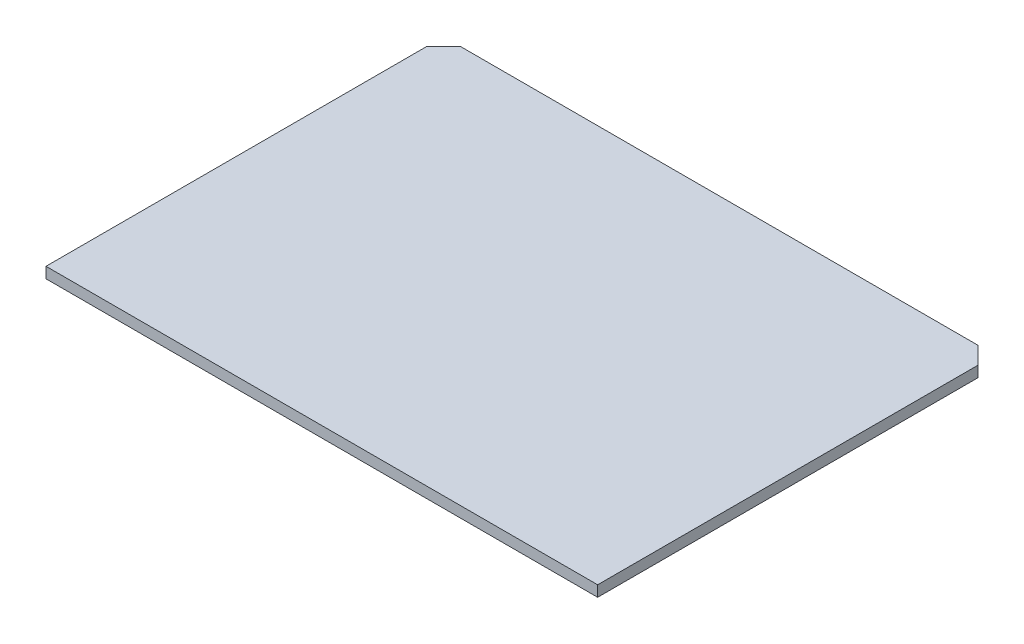
ISO-10303-21;
HEADER;
FILE_DESCRIPTION(('STEP AP214'),'2;1');
FILE_NAME('part.step','',(''),(''),'','','');
FILE_SCHEMA(('AUTOMOTIVE_DESIGN { 1 0 10303 214 1 1 1 1 }'));
ENDSEC;
DATA;
#1=APPLICATION_CONTEXT('core data for automotive mechanical design processes');
#2=APPLICATION_PROTOCOL_DEFINITION('international standard','automotive_design',2000,#1);
#3=PRODUCT_CONTEXT('',#1,'mechanical');
#4=PRODUCT('Part','Part','',(#3));
#5=PRODUCT_RELATED_PRODUCT_CATEGORY('part','',(#4));
#6=PRODUCT_DEFINITION_FORMATION('','',#4);
#7=PRODUCT_DEFINITION_CONTEXT('part definition',#1,'design');
#8=PRODUCT_DEFINITION('design','',#6,#7);
#9=PRODUCT_DEFINITION_SHAPE('','',#8);
#10=(LENGTH_UNIT() NAMED_UNIT(*) SI_UNIT(.MILLI.,.METRE.));
#11=(NAMED_UNIT(*) PLANE_ANGLE_UNIT() SI_UNIT($,.RADIAN.));
#12=(NAMED_UNIT(*) SI_UNIT($,.STERADIAN.) SOLID_ANGLE_UNIT());
#13=UNCERTAINTY_MEASURE_WITH_UNIT(LENGTH_MEASURE(1.E-05),#10,'distance_accuracy_value','');
#14=(GEOMETRIC_REPRESENTATION_CONTEXT(3) GLOBAL_UNCERTAINTY_ASSIGNED_CONTEXT((#13)) GLOBAL_UNIT_ASSIGNED_CONTEXT((#10,
#11,#12)) REPRESENTATION_CONTEXT('',''));
#15=CARTESIAN_POINT('',(0.,0.,0.));
#16=DIRECTION('',(0.,0.,1.));
#17=DIRECTION('',(1.,0.,0.));
#18=AXIS2_PLACEMENT_3D('',#15,#16,#17);
#19=CARTESIAN_POINT('',(40.64,1.6,-29.29));
#20=DIRECTION('',(-1.,0.,0.));
#21=DIRECTION('',(0.,0.,1.));
#22=AXIS2_PLACEMENT_3D('',#19,#20,#21);
#23=PLANE('',#22);
#24=DIRECTION('',(0.,0.,-1.));
#25=VECTOR('',#24,1.);
#26=CARTESIAN_POINT('',(40.64,0.,-29.29));
#27=LINE('',#26,#25);
#28=CARTESIAN_POINT('',(40.64,0.,29.29));
#29=VERTEX_POINT('',#28);
#30=CARTESIAN_POINT('',(40.64,0.,-26.75));
#31=VERTEX_POINT('',#30);
#32=EDGE_CURVE('E110',#29,#31,#27,.T.);
#33=ORIENTED_EDGE('',*,*,#32,.T.);
#34=DIRECTION('',(0.,1.,0.));
#35=VECTOR('',#34,1.);
#36=CARTESIAN_POINT('',(40.64,1.6,-26.75));
#37=LINE('',#36,#35);
#38=CARTESIAN_POINT('',(40.64,1.6,-26.75));
#39=VERTEX_POINT('',#38);
#40=EDGE_CURVE('E54',#31,#39,#37,.T.);
#41=ORIENTED_EDGE('',*,*,#40,.T.);
#42=DIRECTION('',(0.,0.,-1.));
#43=VECTOR('',#42,1.);
#44=CARTESIAN_POINT('',(40.64,1.6,-29.29));
#45=LINE('',#44,#43);
#46=CARTESIAN_POINT('',(40.64,1.6,29.29));
#47=VERTEX_POINT('',#46);
#48=EDGE_CURVE('E117',#47,#39,#45,.T.);
#49=ORIENTED_EDGE('',*,*,#48,.F.);
#50=DIRECTION('',(0.,-1.,0.));
#51=VECTOR('',#50,1.);
#52=CARTESIAN_POINT('',(40.64,1.6,29.29));
#53=LINE('',#52,#51);
#54=EDGE_CURVE('E102',#47,#29,#53,.T.);
#55=ORIENTED_EDGE('',*,*,#54,.T.);
#56=EDGE_LOOP('',(#33,#41,#49,#55));
#57=FACE_BOUND('',#56,.T.);
#58=ADVANCED_FACE('F31',(#57),#23,.F.);
#59=CARTESIAN_POINT('',(-40.64,1.6,-29.29));
#60=DIRECTION('',(0.,0.,1.));
#61=DIRECTION('',(1.,0.,0.));
#62=AXIS2_PLACEMENT_3D('',#59,#60,#61);
#63=PLANE('',#62);
#64=DIRECTION('',(-1.,0.,0.));
#65=VECTOR('',#64,1.);
#66=CARTESIAN_POINT('',(-40.64,1.6,-29.29));
#67=LINE('',#66,#65);
#68=CARTESIAN_POINT('',(38.1,1.6,-29.29));
#69=VERTEX_POINT('',#68);
#70=CARTESIAN_POINT('',(-38.1,1.6,-29.29));
#71=VERTEX_POINT('',#70);
#72=EDGE_CURVE('E92',#69,#71,#67,.T.);
#73=ORIENTED_EDGE('',*,*,#72,.F.);
#74=DIRECTION('',(0.,-1.,0.));
#75=VECTOR('',#74,1.);
#76=CARTESIAN_POINT('',(38.1,1.6,-29.29));
#77=LINE('',#76,#75);
#78=CARTESIAN_POINT('',(38.1,0.,-29.29));
#79=VERTEX_POINT('',#78);
#80=EDGE_CURVE('E120',#69,#79,#77,.T.);
#81=ORIENTED_EDGE('',*,*,#80,.T.);
#82=DIRECTION('',(-1.,0.,0.));
#83=VECTOR('',#82,1.);
#84=CARTESIAN_POINT('',(-40.64,0.,-29.29));
#85=LINE('',#84,#83);
#86=CARTESIAN_POINT('',(-38.1,0.,-29.29));
#87=VERTEX_POINT('',#86);
#88=EDGE_CURVE('E112',#79,#87,#85,.T.);
#89=ORIENTED_EDGE('',*,*,#88,.T.);
#90=DIRECTION('',(0.,1.,0.));
#91=VECTOR('',#90,1.);
#92=CARTESIAN_POINT('',(-38.1,1.6,-29.29));
#93=LINE('',#92,#91);
#94=EDGE_CURVE('E101',#87,#71,#93,.T.);
#95=ORIENTED_EDGE('',*,*,#94,.T.);
#96=EDGE_LOOP('',(#73,#81,#89,#95));
#97=FACE_BOUND('',#96,.T.);
#98=ADVANCED_FACE('F133',(#97),#63,.F.);
#99=CARTESIAN_POINT('',(-40.64,1.6,-29.29));
#100=DIRECTION('',(1.,0.,0.));
#101=DIRECTION('',(0.,0.,-1.));
#102=AXIS2_PLACEMENT_3D('',#99,#100,#101);
#103=PLANE('',#102);
#104=DIRECTION('',(0.,0.,1.));
#105=VECTOR('',#104,1.);
#106=CARTESIAN_POINT('',(-40.64,1.6,-29.29));
#107=LINE('',#106,#105);
#108=CARTESIAN_POINT('',(-40.64,1.6,-26.75));
#109=VERTEX_POINT('',#108);
#110=CARTESIAN_POINT('',(-40.64,1.6,29.29));
#111=VERTEX_POINT('',#110);
#112=EDGE_CURVE('E84',#109,#111,#107,.T.);
#113=ORIENTED_EDGE('',*,*,#112,.F.);
#114=DIRECTION('',(0.,-1.,0.));
#115=VECTOR('',#114,1.);
#116=CARTESIAN_POINT('',(-40.64,1.6,-26.75));
#117=LINE('',#116,#115);
#118=CARTESIAN_POINT('',(-40.64,0.,-26.75));
#119=VERTEX_POINT('',#118);
#120=EDGE_CURVE('E11',#109,#119,#117,.T.);
#121=ORIENTED_EDGE('',*,*,#120,.T.);
#122=DIRECTION('',(0.,0.,1.));
#123=VECTOR('',#122,1.);
#124=CARTESIAN_POINT('',(-40.64,0.,-29.29));
#125=LINE('',#124,#123);
#126=CARTESIAN_POINT('',(-40.64,0.,29.29));
#127=VERTEX_POINT('',#126);
#128=EDGE_CURVE('E98',#119,#127,#125,.T.);
#129=ORIENTED_EDGE('',*,*,#128,.T.);
#130=DIRECTION('',(0.,-1.,0.));
#131=VECTOR('',#130,1.);
#132=CARTESIAN_POINT('',(-40.64,1.6,29.29));
#133=LINE('',#132,#131);
#134=EDGE_CURVE('E95',#111,#127,#133,.T.);
#135=ORIENTED_EDGE('',*,*,#134,.F.);
#136=EDGE_LOOP('',(#113,#121,#129,#135));
#137=FACE_BOUND('',#136,.T.);
#138=ADVANCED_FACE('F96',(#137),#103,.F.);
#139=CARTESIAN_POINT('',(-40.64,1.6,29.29));
#140=DIRECTION('',(0.,0.,-1.));
#141=DIRECTION('',(-1.,0.,0.));
#142=AXIS2_PLACEMENT_3D('',#139,#140,#141);
#143=PLANE('',#142);
#144=DIRECTION('',(1.,0.,0.));
#145=VECTOR('',#144,1.);
#146=CARTESIAN_POINT('',(-40.64,0.,29.29));
#147=LINE('',#146,#145);
#148=EDGE_CURVE('E116',#127,#29,#147,.T.);
#149=ORIENTED_EDGE('',*,*,#148,.T.);
#150=ORIENTED_EDGE('',*,*,#54,.F.);
#151=DIRECTION('',(1.,0.,0.));
#152=VECTOR('',#151,1.);
#153=CARTESIAN_POINT('',(-40.64,1.6,29.29));
#154=LINE('',#153,#152);
#155=EDGE_CURVE('E88',#111,#47,#154,.T.);
#156=ORIENTED_EDGE('',*,*,#155,.F.);
#157=ORIENTED_EDGE('',*,*,#134,.T.);
#158=EDGE_LOOP('',(#149,#150,#156,#157));
#159=FACE_BOUND('',#158,.T.);
#160=ADVANCED_FACE('F104',(#159),#143,.F.);
#161=CARTESIAN_POINT('',(40.64,1.6,29.29));
#162=DIRECTION('',(0.,1.,0.));
#163=DIRECTION('',(0.,0.,1.));
#164=AXIS2_PLACEMENT_3D('',#161,#162,#163);
#165=PLANE('',#164);
#166=ORIENTED_EDGE('',*,*,#48,.T.);
#167=DIRECTION('',(0.707106781186548,0.,0.707106781186548));
#168=VECTOR('',#167,1.);
#169=CARTESIAN_POINT('',(68.66,1.6,1.26999999999999));
#170=LINE('',#169,#168);
#171=EDGE_CURVE('E39',#39,#69,#170,.F.);
#172=ORIENTED_EDGE('',*,*,#171,.T.);
#173=ORIENTED_EDGE('',*,*,#72,.T.);
#174=DIRECTION('',(0.70710678118655,0.,-0.707106781186546));
#175=VECTOR('',#174,1.);
#176=CARTESIAN_POINT('',(-28.0199999999998,1.6,-39.3700000000002));
#177=LINE('',#176,#175);
#178=EDGE_CURVE('E46',#71,#109,#177,.F.);
#179=ORIENTED_EDGE('',*,*,#178,.T.);
#180=ORIENTED_EDGE('',*,*,#112,.T.);
#181=ORIENTED_EDGE('',*,*,#155,.T.);
#182=EDGE_LOOP('',(#166,#172,#173,#179,#180,#181));
#183=FACE_BOUND('',#182,.T.);
#184=ADVANCED_FACE('F86',(#183),#165,.T.);
#185=CARTESIAN_POINT('',(40.64,0.,29.29));
#186=DIRECTION('',(0.,1.,0.));
#187=DIRECTION('',(0.,0.,1.));
#188=AXIS2_PLACEMENT_3D('',#185,#186,#187);
#189=PLANE('',#188);
#190=ORIENTED_EDGE('',*,*,#88,.F.);
#191=DIRECTION('',(-0.707106781186548,0.,-0.707106781186548));
#192=VECTOR('',#191,1.);
#193=CARTESIAN_POINT('',(38.1,0.,-29.29));
#194=LINE('',#193,#192);
#195=EDGE_CURVE('E125',#79,#31,#194,.F.);
#196=ORIENTED_EDGE('',*,*,#195,.T.);
#197=ORIENTED_EDGE('',*,*,#32,.F.);
#198=ORIENTED_EDGE('',*,*,#148,.F.);
#199=ORIENTED_EDGE('',*,*,#128,.F.);
#200=DIRECTION('',(-0.70710678118655,0.,0.707106781186546));
#201=VECTOR('',#200,1.);
#202=CARTESIAN_POINT('',(-40.64,0.,-26.75));
#203=LINE('',#202,#201);
#204=EDGE_CURVE('E123',#119,#87,#203,.F.);
#205=ORIENTED_EDGE('',*,*,#204,.T.);
#206=EDGE_LOOP('',(#190,#196,#197,#198,#199,#205));
#207=FACE_BOUND('',#206,.T.);
#208=ADVANCED_FACE('F139',(#207),#189,.F.);
#209=CARTESIAN_POINT('',(38.1,1.6,-29.29));
#210=DIRECTION('',(-0.707106781186548,0.,0.707106781186548));
#211=DIRECTION('',(0.707106781186548,0.,0.707106781186548));
#212=AXIS2_PLACEMENT_3D('',#209,#210,#211);
#213=PLANE('',#212);
#214=ORIENTED_EDGE('',*,*,#171,.F.);
#215=ORIENTED_EDGE('',*,*,#40,.F.);
#216=ORIENTED_EDGE('',*,*,#195,.F.);
#217=ORIENTED_EDGE('',*,*,#80,.F.);
#218=EDGE_LOOP('',(#214,#215,#216,#217));
#219=FACE_BOUND('',#218,.T.);
#220=ADVANCED_FACE('F136',(#219),#213,.F.);
#221=CARTESIAN_POINT('',(-40.64,1.6,-26.75));
#222=DIRECTION('',(0.707106781186546,0.,0.70710678118655));
#223=DIRECTION('',(0.70710678118655,0.,-0.707106781186546));
#224=AXIS2_PLACEMENT_3D('',#221,#222,#223);
#225=PLANE('',#224);
#226=ORIENTED_EDGE('',*,*,#178,.F.);
#227=ORIENTED_EDGE('',*,*,#94,.F.);
#228=ORIENTED_EDGE('',*,*,#204,.F.);
#229=ORIENTED_EDGE('',*,*,#120,.F.);
#230=EDGE_LOOP('',(#226,#227,#228,#229));
#231=FACE_BOUND('',#230,.T.);
#232=ADVANCED_FACE('F33',(#231),#225,.F.);
#233=CLOSED_SHELL('',(#58,#98,#138,#160,#184,#208,#220,#232));
#234=MANIFOLD_SOLID_BREP('B2',#233);
#235=ADVANCED_BREP_SHAPE_REPRESENTATION('',(#18,#234),#14);
#236=SHAPE_DEFINITION_REPRESENTATION(#9,#235);
ENDSEC;
END-ISO-10303-21;
